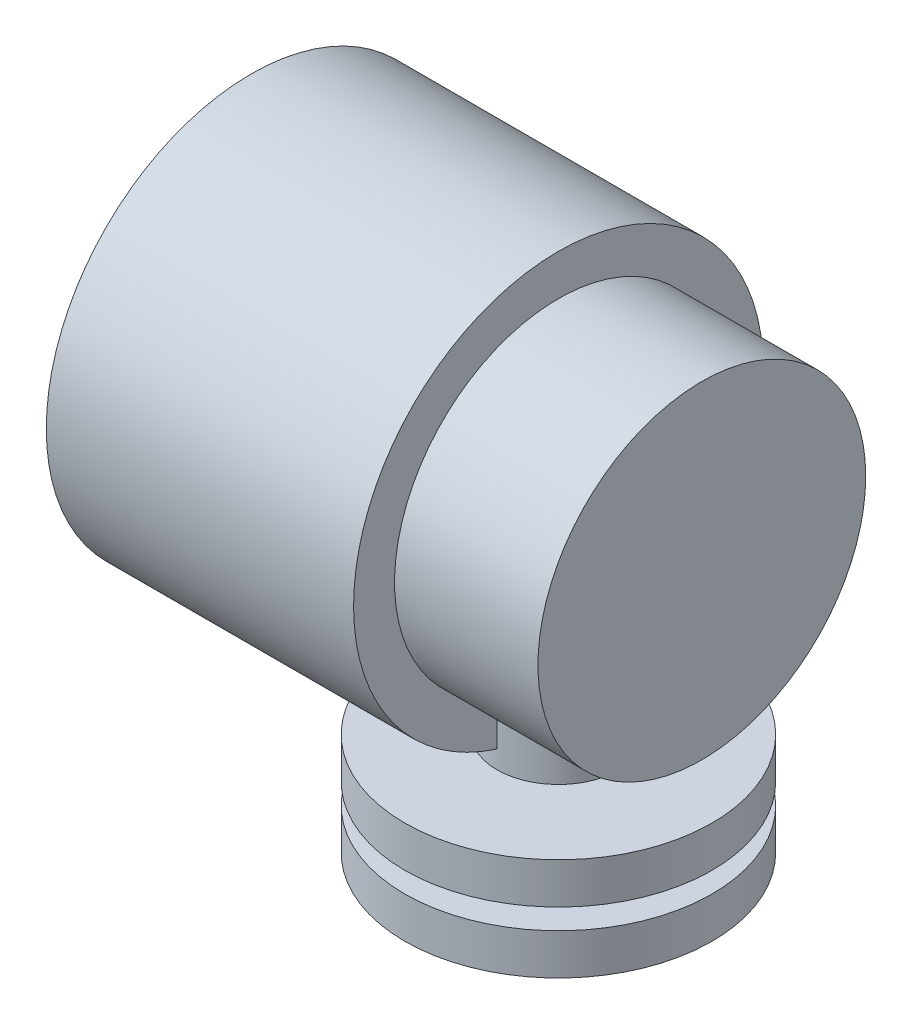
ISO-10303-21;
HEADER;
FILE_DESCRIPTION(('STEP AP214'),'2;1');
FILE_NAME('part.step','',(''),(''),'','','');
FILE_SCHEMA(('AUTOMOTIVE_DESIGN { 1 0 10303 214 1 1 1 1 }'));
ENDSEC;
DATA;
#1=APPLICATION_CONTEXT('core data for automotive mechanical design processes');
#2=APPLICATION_PROTOCOL_DEFINITION('international standard','automotive_design',2000,#1);
#3=PRODUCT_CONTEXT('',#1,'mechanical');
#4=PRODUCT('Part','Part','',(#3));
#5=PRODUCT_RELATED_PRODUCT_CATEGORY('part','',(#4));
#6=PRODUCT_DEFINITION_FORMATION('','',#4);
#7=PRODUCT_DEFINITION_CONTEXT('part definition',#1,'design');
#8=PRODUCT_DEFINITION('design','',#6,#7);
#9=PRODUCT_DEFINITION_SHAPE('','',#8);
#10=(LENGTH_UNIT() NAMED_UNIT(*) SI_UNIT(.MILLI.,.METRE.));
#11=(NAMED_UNIT(*) PLANE_ANGLE_UNIT() SI_UNIT($,.RADIAN.));
#12=(NAMED_UNIT(*) SI_UNIT($,.STERADIAN.) SOLID_ANGLE_UNIT());
#13=UNCERTAINTY_MEASURE_WITH_UNIT(LENGTH_MEASURE(1.E-05),#10,'distance_accuracy_value','');
#14=(GEOMETRIC_REPRESENTATION_CONTEXT(3) GLOBAL_UNCERTAINTY_ASSIGNED_CONTEXT((#13)) GLOBAL_UNIT_ASSIGNED_CONTEXT((#10,
#11,#12)) REPRESENTATION_CONTEXT('',''));
#15=CARTESIAN_POINT('',(0.,0.,0.));
#16=DIRECTION('',(0.,0.,1.));
#17=DIRECTION('',(1.,0.,0.));
#18=AXIS2_PLACEMENT_3D('',#15,#16,#17);
#19=CARTESIAN_POINT('',(0.,150.,0.));
#20=DIRECTION('',(0.,-1.,0.));
#21=DIRECTION('',(0.,0.,-1.));
#22=AXIS2_PLACEMENT_3D('',#19,#20,#21);
#23=CYLINDRICAL_SURFACE('',#22,30.);
#24=CARTESIAN_POINT('',(0.,50.,0.));
#25=DIRECTION('',(0.,1.,0.));
#26=DIRECTION('',(0.,0.,1.));
#27=AXIS2_PLACEMENT_3D('',#24,#25,#26);
#28=CIRCLE('',#27,30.);
#29=CARTESIAN_POINT('',(0.,50.,30.));
#30=VERTEX_POINT('',#29);
#31=EDGE_CURVE('E89',#30,#30,#28,.T.);
#32=ORIENTED_EDGE('',*,*,#31,.T.);
#33=EDGE_LOOP('',(#32));
#34=FACE_BOUND('',#33,.T.);
#35=CARTESIAN_POINT('',(0.,80.0397782301648,30.));
#36=CARTESIAN_POINT('',(0.40579539279083,80.0397879025387,30.0000073395257));
#37=CARTESIAN_POINT('',(0.811585417575759,80.0364478265582,29.9917665920883));
#38=CARTESIAN_POINT('',(1.62238061110944,80.0231395354518,29.9588448257795));
#39=CARTESIAN_POINT('',(2.02738579674918,80.0131714645961,29.9341641647523));
#40=CARTESIAN_POINT('',(2.83572192518221,79.9866828937842,29.8684292848374));
#41=CARTESIAN_POINT('',(3.23905337498199,79.9701645507436,29.8273804557401));
#42=CARTESIAN_POINT('',(4.04338640606967,79.9307221828093,29.7290303732851));
#43=CARTESIAN_POINT('',(4.44438798247671,79.9077981445012,29.6717290858926));
#44=CARTESIAN_POINT('',(5.63996051176829,79.8298666660759,29.4761107876277));
#45=CARTESIAN_POINT('',(6.43016306529853,79.7655971463917,29.3138287836264));
#46=CARTESIAN_POINT('',(7.99280874012618,79.6143667724142,28.9268604665318));
#47=CARTESIAN_POINT('',(8.76525095603184,79.527404764075,28.7021709796151));
#48=CARTESIAN_POINT('',(10.2866659540252,79.3335671687564,28.1926834691583));
#49=CARTESIAN_POINT('',(11.0356598893483,79.2267101718325,27.9079415264612));
#50=CARTESIAN_POINT('',(12.5062898905835,78.9961801300261,27.280613451533));
#51=CARTESIAN_POINT('',(13.227925981781,78.8725071006863,26.9380273727659));
#52=CARTESIAN_POINT('',(14.6402550479721,78.6117177729883,26.197313846308));
#53=CARTESIAN_POINT('',(15.3309242856197,78.4745914103814,25.7991447221056));
#54=CARTESIAN_POINT('',(16.67700757806,78.1906479220418,24.9501636260264));
#55=CARTESIAN_POINT('',(17.332420569718,78.0438305043771,24.4993500679809));
#56=CARTESIAN_POINT('',(18.6331592820346,77.7375408271672,23.526459018209));
#57=CARTESIAN_POINT('',(19.276707305637,77.5777963775227,23.0020890778474));
#58=CARTESIAN_POINT('',(20.5178842579502,77.2561706090069,21.9021477188022));
#59=CARTESIAN_POINT('',(21.1155119320614,77.0942892318937,21.3265749021205));
#60=CARTESIAN_POINT('',(22.2614436825659,76.7726384625389,20.1274927103534));
#61=CARTESIAN_POINT('',(22.8097386993681,76.6128694627974,19.5039745692845));
#62=CARTESIAN_POINT('',(23.8534731540498,76.2996430425896,18.2126618067676));
#63=CARTESIAN_POINT('',(24.3489119290149,76.1461857012981,17.5448666301747));
#64=CARTESIAN_POINT('',(25.2995619388411,75.8445190200705,16.1453373464467));
#65=CARTESIAN_POINT('',(25.7528225132963,75.6966676732512,15.4121987459059));
#66=CARTESIAN_POINT('',(26.5956600696632,75.4161606834532,13.9073573772824));
#67=CARTESIAN_POINT('',(26.9852351740977,75.2835054884988,13.1356534731519));
#68=CARTESIAN_POINT('',(27.6971758191201,75.0372383747024,11.5591623402783));
#69=CARTESIAN_POINT('',(28.0195611532319,74.9236208494671,10.7543849385764));
#70=CARTESIAN_POINT('',(28.5941499419499,74.718725324469,9.11739696552244));
#71=CARTESIAN_POINT('',(28.8463572881372,74.6274460860147,8.2851879182013));
#72=CARTESIAN_POINT('',(29.2686626317384,74.473363683673,6.63613451889494));
#73=CARTESIAN_POINT('',(29.4418324099147,74.4095022942871,5.8201751488959));
#74=CARTESIAN_POINT('',(29.7197575652586,74.306536206528,4.17513733314446));
#75=CARTESIAN_POINT('',(29.8245147354877,74.2674308593117,3.34605923181107));
#76=CARTESIAN_POINT('',(29.9644817536562,74.2151020328293,1.68145495271481));
#77=CARTESIAN_POINT('',(29.9997097098196,74.2018718146395,0.845930510764572));
#78=CARTESIAN_POINT('',(30.0002866860024,74.2016557391656,-0.8251337619089));
#79=CARTESIAN_POINT('',(29.9656378185693,74.2146690884741,-1.66067359140325));
#80=CARTESIAN_POINT('',(29.830292621019,74.2652713700129,-3.28385923236636));
#81=CARTESIAN_POINT('',(29.7329539746228,74.301610645863,-4.07182679206193));
#82=CARTESIAN_POINT('',(29.4764518061509,74.3967067092277,-5.63622487086478));
#83=CARTESIAN_POINT('',(29.3172907060554,74.4554626185381,-6.41265584069687));
#84=CARTESIAN_POINT('',(28.9386117673637,74.5938977354721,-7.94874475410298));
#85=CARTESIAN_POINT('',(28.7190926207766,74.6735773965229,-8.70840233380326));
#86=CARTESIAN_POINT('',(28.2216116158889,74.8518703966128,-10.2060419095514));
#87=CARTESIAN_POINT('',(27.9436482388661,74.9504842276664,-10.9440233417583));
#88=CARTESIAN_POINT('',(27.3270903955946,75.1657887524703,-12.4043295276657));
#89=CARTESIAN_POINT('',(26.987674433351,75.2827210549745,-13.1262715439436));
#90=CARTESIAN_POINT('',(26.2536214729305,75.5307179279836,-14.5389486832708));
#91=CARTESIAN_POINT('',(25.858984272494,75.6617825502507,-15.2296836920055));
#92=CARTESIAN_POINT('',(25.0171411701662,75.9349193726573,-16.5762883887225));
#93=CARTESIAN_POINT('',(24.5699214269451,76.0769944677193,-17.2321488303779));
#94=CARTESIAN_POINT('',(23.625852155539,76.3687406780442,-18.5053302188003));
#95=CARTESIAN_POINT('',(23.1290008004782,76.5184120728175,-19.1226497455655));
#96=CARTESIAN_POINT('',(22.0581537782246,76.8306782140225,-20.350419530541));
#97=CARTESIAN_POINT('',(21.4813460920814,76.9935169018118,-20.9583576992742));
#98=CARTESIAN_POINT('',(20.2789353118229,77.3193830347847,-22.1238764242189));
#99=CARTESIAN_POINT('',(19.6533300749009,77.4824104879472,-22.6814547666983));
#100=CARTESIAN_POINT('',(18.3567478882296,77.8042778852202,-23.7430427892749));
#101=CARTESIAN_POINT('',(17.6857528317753,77.9631161226497,-24.2470308827333));
#102=CARTESIAN_POINT('',(16.3025295618933,78.2720712568554,-25.1978541907368));
#103=CARTESIAN_POINT('',(15.5903022072286,78.4221883351406,-25.6446905949832));
#104=CARTESIAN_POINT('',(14.1121654111187,78.7125825837291,-26.4874854617448));
#105=CARTESIAN_POINT('',(13.3454032217024,78.8525581206962,-26.8820548416311));
#106=CARTESIAN_POINT('',(11.7780480128968,79.1143109731033,-27.6047527182499));
#107=CARTESIAN_POINT('',(10.9774510094884,79.2360861377643,-27.9328733642097));
#108=CARTESIAN_POINT('',(9.34928210739249,79.4571328804903,-28.5190878302284));
#109=CARTESIAN_POINT('',(8.52175091342002,79.5564367630528,-28.7772822820465));
#110=CARTESIAN_POINT('',(6.84529130680359,79.729196526589,-29.2214591998688));
#111=CARTESIAN_POINT('',(5.99637273562403,79.8026640715641,-29.407474255715));
#112=CARTESIAN_POINT('',(4.29262867381386,79.9204550325197,-29.7037475521464));
#113=CARTESIAN_POINT('',(3.4379624917219,79.9650806309272,-29.8147918437874));
#114=CARTESIAN_POINT('',(2.15111855274515,80.009827753634,-29.9258766263631));
#115=CARTESIAN_POINT('',(1.72153690480331,80.0210448593565,-29.9536579105474));
#116=CARTESIAN_POINT('',(0.861324758103332,80.0360247816641,-29.9907231908412));
#117=CARTESIAN_POINT('',(0.430693996328158,80.0397854822567,-30.0000019362698));
#118=CARTESIAN_POINT('',(0.,80.0397782301648,-30.));
#119=B_SPLINE_CURVE_WITH_KNOTS('',3,(#35,#36,#37,#38,#39,#40,#41,#42,#43,#44,#45,#46,#47,#48,
#49,#50,#51,#52,#53,#54,#55,#56,#57,#58,#59,#60,#61,#62,#63,#64,#65,#66,#67,#68,#69,#70,#71,#72,
#73,#74,#75,#76,#77,#78,#79,#80,#81,#82,#83,#84,#85,#86,#87,#88,#89,#90,#91,#92,#93,#94,#95,#96,
#97,#98,#99,#100,#101,#102,#103,#104,#105,#106,#107,#108,#109,#110,#111,#112,#113,#114,#115,
#116,#117,#118),.UNSPECIFIED.,.F.,.F.,(4,2,2,2,2,2,2,2,2,2,2,2,2,2,2,2,2,2,2,2,2,2,2,2,2,2,2,2,
2,2,2,2,2,2,2,2,2,2,2,2,2,4),(0.,1.21727889385095,2.43453129232049,3.6513831985281,
4.8682376529988,7.29275028771033,9.71738624712956,12.1397678731605,14.5621472602576,
16.9863528169917,19.4106314335183,21.9438817475245,24.4772012484077,27.0109850298422,
29.5448005858435,32.1651150851438,34.7855068186038,37.405125512823,40.0245989123231,
42.531113525836,45.0375624421727,47.5433584914931,50.0490787855931,52.430642011003,
54.8121119447908,57.1936334903671,59.5752169294241,61.9913689846536,64.4075298897877,
66.8243282321253,69.2412155665092,71.799417931293,74.3577326956223,76.9170740994167,
79.4763622178597,82.0938864929423,84.7117198426068,87.3257655677455,89.9386296434542,
92.5236543695132,93.8151281351747,95.1069683452501),.UNSPECIFIED.);
#120=CARTESIAN_POINT('',(0.,80.0397782301648,30.));
#121=VERTEX_POINT('',#120);
#122=CARTESIAN_POINT('',(0.,80.0397782301648,-30.));
#123=VERTEX_POINT('',#122);
#124=EDGE_CURVE('E54',#121,#123,#119,.T.);
#125=ORIENTED_EDGE('',*,*,#124,.F.);
#126=DIRECTION('',(0.,-1.,0.));
#127=VECTOR('',#126,1.);
#128=CARTESIAN_POINT('',(0.,150.,30.));
#129=LINE('',#128,#127);
#130=CARTESIAN_POINT('',(0.,58.8078429594269,30.));
#131=VERTEX_POINT('',#130);
#132=EDGE_CURVE('E60',#121,#131,#129,.T.);
#133=ORIENTED_EDGE('',*,*,#132,.T.);
#134=CARTESIAN_POINT('',(0.,58.8078429594269,30.));
#135=CARTESIAN_POINT('',(-0.411696853847507,58.8078474654858,30.0000016465914));
#136=CARTESIAN_POINT('',(-0.823345471288527,58.8051769327793,29.9915240983082));
#137=CARTESIAN_POINT('',(-1.64586321395522,58.7945311956787,29.9576461083608));
#138=CARTESIAN_POINT('',(-2.05673236508141,58.7865561707546,29.9322462392396));
#139=CARTESIAN_POINT('',(-3.28682676320697,58.7547515277061,29.8307453344747));
#140=CARTESIAN_POINT('',(-4.10390269022611,58.7230422634249,29.7293429343204));
#141=CARTESIAN_POINT('',(-5.7238928888373,58.6396883939953,29.4603051313761));
#142=CARTESIAN_POINT('',(-6.52683775293299,58.5880944152745,29.2928379041291));
#143=CARTESIAN_POINT('',(-7.71776687628569,58.4969726858323,28.9931681162346));
#144=CARTESIAN_POINT('',(-8.11252017400425,58.4643077735553,28.8851915264413));
#145=CARTESIAN_POINT('',(-8.89702596368227,58.3946422595519,28.6532768247172));
#146=CARTESIAN_POINT('',(-9.28677724127981,58.3576406262748,28.5293349145113));
#147=CARTESIAN_POINT('',(-10.4469284110616,58.2405887467968,28.1341207902509));
#148=CARTESIAN_POINT('',(-11.2088311298958,58.154444545115,27.8393075942736));
#149=CARTESIAN_POINT('',(-12.7046729490838,57.9684126405507,27.1892697330545));
#150=CARTESIAN_POINT('',(-13.4386111036437,57.8685244733574,26.8340430267744));
#151=CARTESIAN_POINT('',(-14.5151674856254,57.7105003452203,26.2578717443678));
#152=CARTESIAN_POINT('',(-14.8700880800592,57.6564387798433,26.0585109022265));
#153=CARTESIAN_POINT('',(-15.5711664737974,57.5459746440265,25.6457444467873));
#154=CARTESIAN_POINT('',(-15.9173264973093,57.4895726775841,25.4323424489274));
#155=CARTESIAN_POINT('',(-16.9420864703225,57.317393971888,24.7714816311906));
#156=CARTESIAN_POINT('',(-17.6070096380867,57.1986379955127,24.3033447881837));
#157=CARTESIAN_POINT('',(-18.9144527937109,56.9529464444706,23.3011017293805));
#158=CARTESIAN_POINT('',(-19.5557941416024,56.8258742092625,22.7654955879419));
#159=CARTESIAN_POINT('',(-20.7914588190844,56.5702141310477,21.6428277143832));
#160=CARTESIAN_POINT('',(-21.3857812727378,56.4416262598569,21.0557650240841));
#161=CARTESIAN_POINT('',(-22.5237046305128,56.1864087483972,19.8338063570967));
#162=CARTESIAN_POINT('',(-23.0672972221321,56.0597794318796,19.1989025719525));
#163=CARTESIAN_POINT('',(-24.1000886819298,55.8119114534782,17.8852949652361));
#164=CARTESIAN_POINT('',(-24.5892871883703,55.6906728274473,17.2065908524253));
#165=CARTESIAN_POINT('',(-25.519457586839,55.4544284234027,15.7951363164984));
#166=CARTESIAN_POINT('',(-25.9592191254306,55.3396040168212,15.061557027014));
#167=CARTESIAN_POINT('',(-26.7751725102979,55.122223543649,13.5580855076031));
#168=CARTESIAN_POINT('',(-27.1513632084728,55.0196676986405,12.7881926221677));
#169=CARTESIAN_POINT('',(-27.8370138635827,54.8297812021283,11.2176064069145));
#170=CARTESIAN_POINT('',(-28.1464877633683,54.742447370175,10.4169195538902));
#171=CARTESIAN_POINT('',(-28.6960916049933,54.5855182294261,8.79040120555639));
#172=CARTESIAN_POINT('',(-28.9362239197152,54.5159223136452,7.96457057174124));
#173=CARTESIAN_POINT('',(-29.3390898029746,54.3982253292976,6.31788067540471));
#174=CARTESIAN_POINT('',(-29.5038401112551,54.3495665574088,5.49755443219032));
#175=CARTESIAN_POINT('',(-29.764323304671,54.2722908293521,3.8450793134294));
#176=CARTESIAN_POINT('',(-29.8600573815404,54.2436735271195,3.01293064227903));
#177=CARTESIAN_POINT('',(-29.9815998425522,54.2072984544142,1.3432214089331));
#178=CARTESIAN_POINT('',(-30.0074194717559,54.1995373294291,0.505661738769397));
#179=CARTESIAN_POINT('',(-29.9889179743823,54.2050876084533,-1.16860445902703));
#180=CARTESIAN_POINT('',(-29.9445981350525,54.2183986257322,-2.00531100203493));
#181=CARTESIAN_POINT('',(-29.7887749081401,54.2649538960655,-3.6448972702804));
#182=CARTESIAN_POINT('',(-29.6794599031139,54.2975486957585,-4.4480045945686));
#183=CARTESIAN_POINT('',(-29.3964590404347,54.3812564551721,-6.04179049285378));
#184=CARTESIAN_POINT('',(-29.2227747920993,54.4323689519245,-6.83246937706333));
#185=CARTESIAN_POINT('',(-28.8125018026331,54.5517666944704,-8.39601283863162));
#186=CARTESIAN_POINT('',(-28.5759114379064,54.6200523834985,-9.16887695563476));
#187=CARTESIAN_POINT('',(-28.041742187657,54.7720201230656,-10.6916693091853));
#188=CARTESIAN_POINT('',(-27.7441621473015,54.8557024651355,-11.441597111127));
#189=CARTESIAN_POINT('',(-27.0864908924405,55.0373693516697,-12.9223019040715));
#190=CARTESIAN_POINT('',(-26.7257127966786,55.1355089401515,-13.6527546552475));
#191=CARTESIAN_POINT('',(-25.9467420324779,55.3428104345326,-15.0807188951401));
#192=CARTESIAN_POINT('',(-25.5285491328502,55.4519723848144,-15.7782302511982));
#193=CARTESIAN_POINT('',(-24.6375641218611,55.6785477578583,-17.1362206928164));
#194=CARTESIAN_POINT('',(-24.1647619937842,55.7959626928757,-17.796692951358));
#195=CARTESIAN_POINT('',(-23.1677042317755,56.0360438047132,-19.0765716316485));
#196=CARTESIAN_POINT('',(-22.6434473282548,56.1587101110627,-19.6959770394869));
#197=CARTESIAN_POINT('',(-21.5256146152205,56.4109435972014,-20.9130729082772));
#198=CARTESIAN_POINT('',(-20.9301475715969,56.5405946792194,-21.5090103419898));
#199=CARTESIAN_POINT('',(-19.6910604134504,56.7986279250247,-22.6488594191037));
#200=CARTESIAN_POINT('',(-19.047438741379,56.9270100476155,-23.192769378393));
#201=CARTESIAN_POINT('',(-17.715918150193,57.1789494947209,-24.2251132200152));
#202=CARTESIAN_POINT('',(-17.0280056413348,57.3025053195204,-24.7135299470653));
#203=CARTESIAN_POINT('',(-15.6124669804901,57.5412098346143,-25.6312766075881));
#204=CARTESIAN_POINT('',(-14.8848419977233,57.6563587721923,-26.0606082793412));
#205=CARTESIAN_POINT('',(-13.3870234566783,57.8759712310503,-26.8610479334356));
#206=CARTESIAN_POINT('',(-12.616473712351,57.9803148644521,-27.2315229353529));
#207=CARTESIAN_POINT('',(-11.0448111689831,58.1737473534252,-27.9059742671383));
#208=CARTESIAN_POINT('',(-10.243694795807,58.2628344183306,-28.2099427922908));
#209=CARTESIAN_POINT('',(-8.6178482362357,58.4227797240708,-28.7483067894976));
#210=CARTESIAN_POINT('',(-7.79315065706836,58.4936619004905,-28.9827936782755));
#211=CARTESIAN_POINT('',(-6.12550082324516,58.6149901977444,-29.3804750914129));
#212=CARTESIAN_POINT('',(-5.2825571773222,58.665445743885,-29.5437024992297));
#213=CARTESIAN_POINT('',(-4.06706180604218,58.7218898434071,-29.7253564555913));
#214=CARTESIAN_POINT('',(-3.69912868064064,58.7368615019201,-29.7733815320382));
#215=CARTESIAN_POINT('',(-2.96166702768161,58.7625887896282,-29.8557539689542));
#216=CARTESIAN_POINT('',(-2.5921389324629,58.7733454966809,-29.8901048262629));
#217=CARTESIAN_POINT('',(-1.48295480790027,58.7991844983204,-29.9724950871705));
#218=CARTESIAN_POINT('',(-0.741570892484868,58.8078882882116,-30.0000405850312));
#219=CARTESIAN_POINT('',(0.,58.8078429594269,-30.));
#220=B_SPLINE_CURVE_WITH_KNOTS('',3,(#134,#135,#136,#137,#138,#139,#140,#141,#142,#143,#144,
#145,#146,#147,#148,#149,#150,#151,#152,#153,#154,#155,#156,#157,#158,#159,#160,#161,#162,#163,
#164,#165,#166,#167,#168,#169,#170,#171,#172,#173,#174,#175,#176,#177,#178,#179,#180,#181,#182,
#183,#184,#185,#186,#187,#188,#189,#190,#191,#192,#193,#194,#195,#196,#197,#198,#199,#200,#201,
#202,#203,#204,#205,#206,#207,#208,#209,#210,#211,#212,#213,#214,#215,#216,#217,#218,#219),
.UNSPECIFIED.,.F.,.F.,(4,2,2,2,2,2,2,2,2,2,2,2,2,2,2,2,2,2,2,2,2,2,2,2,2,2,2,2,2,2,2,2,2,2,2,2,
2,2,2,2,2,2,4),(0.,1.23489870695709,2.46975563497965,4.93838198769827,7.40076430686813,
8.63211384841008,9.8637568806045,12.3251704382873,14.7866671700429,16.0183282600266,
17.2496734430609,19.7122155851595,22.2449428529318,24.7777172929624,27.310906022746,
29.844111598028,32.4298449830575,35.0156250619122,37.6008642249601,40.1860149101337,
42.6972483864601,45.2084384991596,47.7192246872678,50.2299647962434,52.6606077392857,
55.0911899170876,57.5218348338821,59.9525257789227,62.411491171566,64.8704664658764,
67.3298935169692,69.7893812669238,72.3435198905142,74.8977411627722,77.4527499156481,
80.0076834841672,82.5884648450846,85.1695489054497,87.7472218090155,90.3237039570024,
91.437551909194,92.5511148393489,94.7748253409106),.UNSPECIFIED.);
#221=CARTESIAN_POINT('',(0.,58.8078429594269,-30.));
#222=VERTEX_POINT('',#221);
#223=EDGE_CURVE('E48',#131,#222,#220,.T.);
#224=ORIENTED_EDGE('',*,*,#223,.T.);
#225=DIRECTION('',(0.,-1.,0.));
#226=VECTOR('',#225,1.);
#227=CARTESIAN_POINT('',(0.,150.,-30.));
#228=LINE('',#227,#226);
#229=EDGE_CURVE('E69',#222,#123,#228,.F.);
#230=ORIENTED_EDGE('',*,*,#229,.T.);
#231=EDGE_LOOP('',(#125,#133,#224,#230));
#232=FACE_BOUND('',#231,.T.);
#233=ADVANCED_FACE('F39',(#34,#232),#23,.T.);
#234=CARTESIAN_POINT('',(0.,20.,0.));
#235=DIRECTION('',(0.,-1.,0.));
#236=DIRECTION('',(0.,0.,-1.));
#237=AXIS2_PLACEMENT_3D('',#234,#235,#236);
#238=CYLINDRICAL_SURFACE('',#237,75.);
#239=CARTESIAN_POINT('',(0.,20.,0.));
#240=DIRECTION('',(0.,1.,0.));
#241=DIRECTION('',(0.,0.,1.));
#242=AXIS2_PLACEMENT_3D('',#239,#240,#241);
#243=CIRCLE('',#242,75.);
#244=CARTESIAN_POINT('',(0.,20.,75.));
#245=VERTEX_POINT('',#244);
#246=EDGE_CURVE('E105',#245,#245,#243,.T.);
#247=ORIENTED_EDGE('',*,*,#246,.F.);
#248=EDGE_LOOP('',(#247));
#249=FACE_BOUND('',#248,.T.);
#250=CARTESIAN_POINT('',(0.,0.,0.));
#251=DIRECTION('',(0.,1.,0.));
#252=DIRECTION('',(0.,0.,1.));
#253=AXIS2_PLACEMENT_3D('',#250,#251,#252);
#254=CIRCLE('',#253,75.);
#255=CARTESIAN_POINT('',(0.,0.,75.));
#256=VERTEX_POINT('',#255);
#257=EDGE_CURVE('E101',#256,#256,#254,.T.);
#258=ORIENTED_EDGE('',*,*,#257,.T.);
#259=EDGE_LOOP('',(#258));
#260=FACE_BOUND('',#259,.T.);
#261=ADVANCED_FACE('F41',(#249,#260),#238,.T.);
#262=CARTESIAN_POINT('',(0.,20.,0.));
#263=DIRECTION('',(0.,1.,0.));
#264=DIRECTION('',(0.,0.,1.));
#265=AXIS2_PLACEMENT_3D('',#262,#263,#264);
#266=PLANE('',#265);
#267=CARTESIAN_POINT('',(0.,20.,0.));
#268=DIRECTION('',(0.,1.,0.));
#269=DIRECTION('',(0.,0.,1.));
#270=AXIS2_PLACEMENT_3D('',#267,#268,#269);
#271=CIRCLE('',#270,60.);
#272=CARTESIAN_POINT('',(0.,20.,60.));
#273=VERTEX_POINT('',#272);
#274=EDGE_CURVE('E93',#273,#273,#271,.T.);
#275=ORIENTED_EDGE('',*,*,#274,.F.);
#276=EDGE_LOOP('',(#275));
#277=FACE_BOUND('',#276,.T.);
#278=ORIENTED_EDGE('',*,*,#246,.T.);
#279=EDGE_LOOP('',(#278));
#280=FACE_BOUND('',#279,.T.);
#281=ADVANCED_FACE('F158',(#277,#280),#266,.T.);
#282=CARTESIAN_POINT('',(0.,0.,0.));
#283=DIRECTION('',(0.,1.,0.));
#284=DIRECTION('',(0.,0.,1.));
#285=AXIS2_PLACEMENT_3D('',#282,#283,#284);
#286=PLANE('',#285);
#287=ORIENTED_EDGE('',*,*,#257,.F.);
#288=EDGE_LOOP('',(#287));
#289=FACE_BOUND('',#288,.T.);
#290=ADVANCED_FACE('F182',(#289),#286,.F.);
#291=CARTESIAN_POINT('',(0.,30.,0.));
#292=DIRECTION('',(0.,-1.,0.));
#293=DIRECTION('',(0.,0.,-1.));
#294=AXIS2_PLACEMENT_3D('',#291,#292,#293);
#295=CYLINDRICAL_SURFACE('',#294,60.);
#296=CARTESIAN_POINT('',(0.,30.,0.));
#297=DIRECTION('',(0.,1.,0.));
#298=DIRECTION('',(0.,0.,1.));
#299=AXIS2_PLACEMENT_3D('',#296,#297,#298);
#300=CIRCLE('',#299,60.);
#301=CARTESIAN_POINT('',(0.,30.,60.));
#302=VERTEX_POINT('',#301);
#303=EDGE_CURVE('E96',#302,#302,#300,.T.);
#304=ORIENTED_EDGE('',*,*,#303,.F.);
#305=EDGE_LOOP('',(#304));
#306=FACE_BOUND('',#305,.T.);
#307=ORIENTED_EDGE('',*,*,#274,.T.);
#308=EDGE_LOOP('',(#307));
#309=FACE_BOUND('',#308,.T.);
#310=ADVANCED_FACE('F170',(#306,#309),#295,.T.);
#311=CARTESIAN_POINT('',(0.,50.,0.));
#312=DIRECTION('',(0.,-1.,0.));
#313=DIRECTION('',(0.,0.,-1.));
#314=AXIS2_PLACEMENT_3D('',#311,#312,#313);
#315=CYLINDRICAL_SURFACE('',#314,75.);
#316=CARTESIAN_POINT('',(0.,50.,0.));
#317=DIRECTION('',(0.,1.,0.));
#318=DIRECTION('',(0.,0.,1.));
#319=AXIS2_PLACEMENT_3D('',#316,#317,#318);
#320=CIRCLE('',#319,75.);
#321=CARTESIAN_POINT('',(0.,50.,75.));
#322=VERTEX_POINT('',#321);
#323=EDGE_CURVE('E83',#322,#322,#320,.T.);
#324=ORIENTED_EDGE('',*,*,#323,.F.);
#325=EDGE_LOOP('',(#324));
#326=FACE_BOUND('',#325,.T.);
#327=CARTESIAN_POINT('',(0.,30.,0.));
#328=DIRECTION('',(0.,1.,0.));
#329=DIRECTION('',(0.,0.,1.));
#330=AXIS2_PLACEMENT_3D('',#327,#328,#329);
#331=CIRCLE('',#330,75.);
#332=CARTESIAN_POINT('',(0.,30.,75.));
#333=VERTEX_POINT('',#332);
#334=EDGE_CURVE('E78',#333,#333,#331,.T.);
#335=ORIENTED_EDGE('',*,*,#334,.T.);
#336=EDGE_LOOP('',(#335));
#337=FACE_BOUND('',#336,.T.);
#338=ADVANCED_FACE('F165',(#326,#337),#315,.T.);
#339=CARTESIAN_POINT('',(0.,50.,0.));
#340=DIRECTION('',(0.,1.,0.));
#341=DIRECTION('',(0.,0.,1.));
#342=AXIS2_PLACEMENT_3D('',#339,#340,#341);
#343=PLANE('',#342);
#344=ORIENTED_EDGE('',*,*,#31,.F.);
#345=EDGE_LOOP('',(#344));
#346=FACE_BOUND('',#345,.T.);
#347=ORIENTED_EDGE('',*,*,#323,.T.);
#348=EDGE_LOOP('',(#347));
#349=FACE_BOUND('',#348,.T.);
#350=ADVANCED_FACE('F162',(#346,#349),#343,.T.);
#351=CARTESIAN_POINT('',(0.,30.,0.));
#352=DIRECTION('',(0.,1.,0.));
#353=DIRECTION('',(0.,0.,1.));
#354=AXIS2_PLACEMENT_3D('',#351,#352,#353);
#355=PLANE('',#354);
#356=ORIENTED_EDGE('',*,*,#303,.T.);
#357=EDGE_LOOP('',(#356));
#358=FACE_BOUND('',#357,.T.);
#359=ORIENTED_EDGE('',*,*,#334,.F.);
#360=EDGE_LOOP('',(#359));
#361=FACE_BOUND('',#360,.T.);
#362=ADVANCED_FACE('F124',(#358,#361),#355,.F.);
#363=CARTESIAN_POINT('',(-150.,154.201763101121,0.));
#364=DIRECTION('',(1.,0.,0.));
#365=DIRECTION('',(0.,0.,-1.));
#366=AXIS2_PLACEMENT_3D('',#363,#364,#365);
#367=CYLINDRICAL_SURFACE('',#366,100.);
#368=CARTESIAN_POINT('',(-150.,154.201763101121,0.));
#369=DIRECTION('',(1.,0.,0.));
#370=DIRECTION('',(0.,0.,-1.));
#371=AXIS2_PLACEMENT_3D('',#368,#369,#370);
#372=CIRCLE('',#371,100.);
#373=CARTESIAN_POINT('',(-150.,154.201763101121,-100.));
#374=VERTEX_POINT('',#373);
#375=EDGE_CURVE('E85',#374,#374,#372,.T.);
#376=ORIENTED_EDGE('',*,*,#375,.T.);
#377=EDGE_LOOP('',(#376));
#378=FACE_BOUND('',#377,.T.);
#379=ORIENTED_EDGE('',*,*,#223,.F.);
#380=CARTESIAN_POINT('',(0.,154.201763101121,0.));
#381=DIRECTION('',(1.,0.,0.));
#382=DIRECTION('',(0.,0.,-1.));
#383=AXIS2_PLACEMENT_3D('',#380,#381,#382);
#384=CIRCLE('',#383,100.);
#385=EDGE_CURVE('E71',#222,#131,#384,.T.);
#386=ORIENTED_EDGE('',*,*,#385,.F.);
#387=EDGE_LOOP('',(#379,#386));
#388=FACE_BOUND('',#387,.T.);
#389=ADVANCED_FACE('F120',(#378,#388),#367,.T.);
#390=CARTESIAN_POINT('',(0.,154.201763101121,0.));
#391=DIRECTION('',(1.,0.,0.));
#392=DIRECTION('',(0.,0.,-1.));
#393=AXIS2_PLACEMENT_3D('',#390,#391,#392);
#394=PLANE('',#393);
#395=ORIENTED_EDGE('',*,*,#132,.F.);
#396=CARTESIAN_POINT('',(0.,154.201763101121,0.));
#397=DIRECTION('',(1.,0.,0.));
#398=DIRECTION('',(0.,0.,-1.));
#399=AXIS2_PLACEMENT_3D('',#396,#397,#398);
#400=CIRCLE('',#399,80.);
#401=EDGE_CURVE('E11',#121,#123,#400,.F.);
#402=ORIENTED_EDGE('',*,*,#401,.T.);
#403=ORIENTED_EDGE('',*,*,#229,.F.);
#404=ORIENTED_EDGE('',*,*,#385,.T.);
#405=EDGE_LOOP('',(#395,#402,#403,#404));
#406=FACE_BOUND('',#405,.T.);
#407=ADVANCED_FACE('F75',(#406),#394,.T.);
#408=CARTESIAN_POINT('',(-150.,154.201763101121,0.));
#409=DIRECTION('',(1.,0.,0.));
#410=DIRECTION('',(0.,0.,-1.));
#411=AXIS2_PLACEMENT_3D('',#408,#409,#410);
#412=PLANE('',#411);
#413=ORIENTED_EDGE('',*,*,#375,.F.);
#414=EDGE_LOOP('',(#413));
#415=FACE_BOUND('',#414,.T.);
#416=ADVANCED_FACE('F128',(#415),#412,.F.);
#417=CARTESIAN_POINT('',(70.,154.201763101121,0.));
#418=DIRECTION('',(-1.,0.,0.));
#419=DIRECTION('',(0.,0.,1.));
#420=AXIS2_PLACEMENT_3D('',#417,#418,#419);
#421=CYLINDRICAL_SURFACE('',#420,80.);
#422=CARTESIAN_POINT('',(70.,154.201763101121,0.));
#423=DIRECTION('',(1.,0.,0.));
#424=DIRECTION('',(0.,0.,-1.));
#425=AXIS2_PLACEMENT_3D('',#422,#423,#424);
#426=CIRCLE('',#425,80.);
#427=CARTESIAN_POINT('',(70.,154.201763101121,-80.));
#428=VERTEX_POINT('',#427);
#429=EDGE_CURVE('E72',#428,#428,#426,.T.);
#430=ORIENTED_EDGE('',*,*,#429,.F.);
#431=EDGE_LOOP('',(#430));
#432=FACE_BOUND('',#431,.T.);
#433=ORIENTED_EDGE('',*,*,#401,.F.);
#434=ORIENTED_EDGE('',*,*,#124,.T.);
#435=EDGE_LOOP('',(#433,#434));
#436=FACE_BOUND('',#435,.T.);
#437=ADVANCED_FACE('F65',(#432,#436),#421,.T.);
#438=CARTESIAN_POINT('',(70.,154.201763101121,0.));
#439=DIRECTION('',(1.,0.,0.));
#440=DIRECTION('',(0.,0.,-1.));
#441=AXIS2_PLACEMENT_3D('',#438,#439,#440);
#442=PLANE('',#441);
#443=ORIENTED_EDGE('',*,*,#429,.T.);
#444=EDGE_LOOP('',(#443));
#445=FACE_BOUND('',#444,.T.);
#446=ADVANCED_FACE('F135',(#445),#442,.T.);
#447=CLOSED_SHELL('',(#233,#261,#281,#290,#310,#338,#350,#362,#389,#407,#416,#437,#446));
#448=MANIFOLD_SOLID_BREP('B2',#447);
#449=ADVANCED_BREP_SHAPE_REPRESENTATION('',(#18,#448),#14);
#450=SHAPE_DEFINITION_REPRESENTATION(#9,#449);
ENDSEC;
END-ISO-10303-21;
